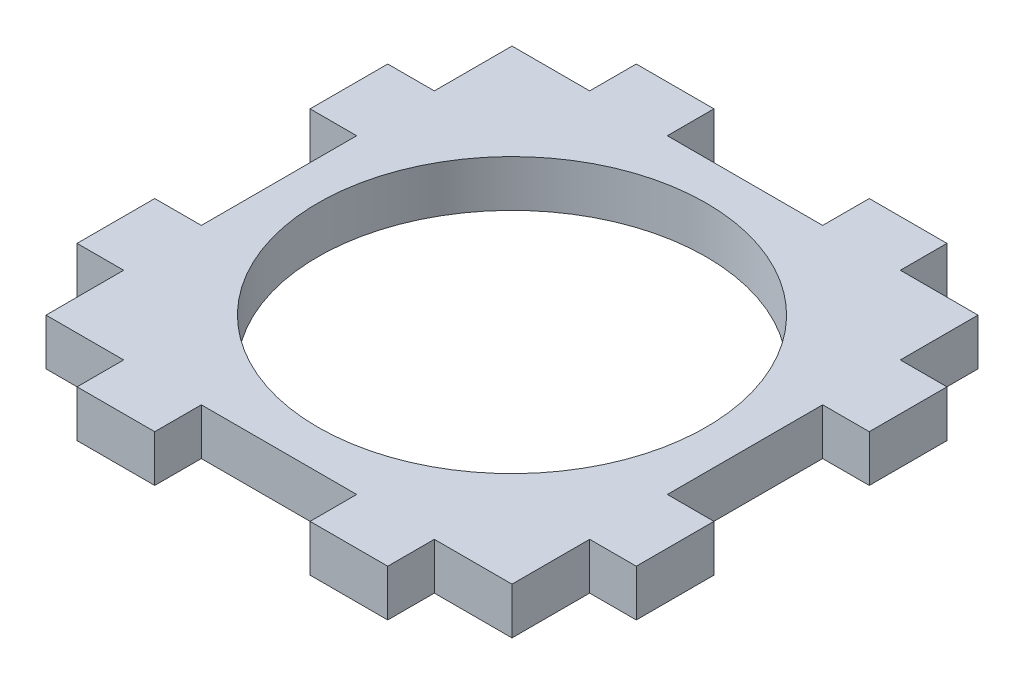
ISO-10303-21;
HEADER;
FILE_DESCRIPTION(('STEP AP214'),'2;1');
FILE_NAME('part.step','',(''),(''),'','','');
FILE_SCHEMA(('AUTOMOTIVE_DESIGN { 1 0 10303 214 1 1 1 1 }'));
ENDSEC;
DATA;
#1=APPLICATION_CONTEXT('core data for automotive mechanical design processes');
#2=APPLICATION_PROTOCOL_DEFINITION('international standard','automotive_design',2000,#1);
#3=PRODUCT_CONTEXT('',#1,'mechanical');
#4=PRODUCT('Part','Part','',(#3));
#5=PRODUCT_RELATED_PRODUCT_CATEGORY('part','',(#4));
#6=PRODUCT_DEFINITION_FORMATION('','',#4);
#7=PRODUCT_DEFINITION_CONTEXT('part definition',#1,'design');
#8=PRODUCT_DEFINITION('design','',#6,#7);
#9=PRODUCT_DEFINITION_SHAPE('','',#8);
#10=(LENGTH_UNIT() NAMED_UNIT(*) SI_UNIT(.MILLI.,.METRE.));
#11=(NAMED_UNIT(*) PLANE_ANGLE_UNIT() SI_UNIT($,.RADIAN.));
#12=(NAMED_UNIT(*) SI_UNIT($,.STERADIAN.) SOLID_ANGLE_UNIT());
#13=UNCERTAINTY_MEASURE_WITH_UNIT(LENGTH_MEASURE(1.E-05),#10,'distance_accuracy_value','');
#14=(GEOMETRIC_REPRESENTATION_CONTEXT(3) GLOBAL_UNCERTAINTY_ASSIGNED_CONTEXT((#13)) GLOBAL_UNIT_ASSIGNED_CONTEXT((#10,
#11,#12)) REPRESENTATION_CONTEXT('',''));
#15=CARTESIAN_POINT('',(0.,0.,0.));
#16=DIRECTION('',(0.,0.,1.));
#17=DIRECTION('',(1.,0.,0.));
#18=AXIS2_PLACEMENT_3D('',#15,#16,#17);
#19=CARTESIAN_POINT('',(30.,6.,0.));
#20=DIRECTION('',(1.,0.,0.));
#21=DIRECTION('',(0.,0.,-1.));
#22=AXIS2_PLACEMENT_3D('',#19,#20,#21);
#23=PLANE('',#22);
#24=DIRECTION('',(0.,0.,1.));
#25=VECTOR('',#24,1.);
#26=CARTESIAN_POINT('',(30.,0.,0.));
#27=LINE('',#26,#25);
#28=CARTESIAN_POINT('',(30.,0.,-30.));
#29=VERTEX_POINT('',#28);
#30=CARTESIAN_POINT('',(30.,0.,-19.9999999999997));
#31=VERTEX_POINT('',#30);
#32=EDGE_CURVE('E302',#29,#31,#27,.T.);
#33=ORIENTED_EDGE('',*,*,#32,.F.);
#34=DIRECTION('',(0.,-1.,0.));
#35=VECTOR('',#34,1.);
#36=CARTESIAN_POINT('',(30.,6.,-30.));
#37=LINE('',#36,#35);
#38=CARTESIAN_POINT('',(30.,6.,-30.));
#39=VERTEX_POINT('',#38);
#40=EDGE_CURVE('E11',#39,#29,#37,.T.);
#41=ORIENTED_EDGE('',*,*,#40,.F.);
#42=DIRECTION('',(0.,0.,1.));
#43=VECTOR('',#42,1.);
#44=CARTESIAN_POINT('',(30.,6.,0.));
#45=LINE('',#44,#43);
#46=CARTESIAN_POINT('',(30.,6.,-19.9999999999997));
#47=VERTEX_POINT('',#46);
#48=EDGE_CURVE('E611',#39,#47,#45,.T.);
#49=ORIENTED_EDGE('',*,*,#48,.T.);
#50=DIRECTION('',(0.,-1.,0.));
#51=VECTOR('',#50,1.);
#52=CARTESIAN_POINT('',(30.,6.,-19.9999999999997));
#53=LINE('',#52,#51);
#54=EDGE_CURVE('E54',#47,#31,#53,.T.);
#55=ORIENTED_EDGE('',*,*,#54,.T.);
#56=EDGE_LOOP('',(#33,#41,#49,#55));
#57=FACE_BOUND('',#56,.T.);
#58=ADVANCED_FACE('F37',(#57),#23,.T.);
#59=CARTESIAN_POINT('',(0.,6.,-30.));
#60=DIRECTION('',(0.,0.,-1.));
#61=DIRECTION('',(-1.,0.,0.));
#62=AXIS2_PLACEMENT_3D('',#59,#60,#61);
#63=PLANE('',#62);
#64=DIRECTION('',(1.,0.,0.));
#65=VECTOR('',#64,1.);
#66=CARTESIAN_POINT('',(0.,0.,-30.));
#67=LINE('',#66,#65);
#68=CARTESIAN_POINT('',(20.0000000000002,0.,-30.));
#69=VERTEX_POINT('',#68);
#70=EDGE_CURVE('E304',#69,#29,#67,.T.);
#71=ORIENTED_EDGE('',*,*,#70,.F.);
#72=DIRECTION('',(0.,-1.,0.));
#73=VECTOR('',#72,1.);
#74=CARTESIAN_POINT('',(20.0000000000002,6.,-30.));
#75=LINE('',#74,#73);
#76=CARTESIAN_POINT('',(20.0000000000002,6.,-30.));
#77=VERTEX_POINT('',#76);
#78=EDGE_CURVE('E46',#77,#69,#75,.T.);
#79=ORIENTED_EDGE('',*,*,#78,.F.);
#80=DIRECTION('',(1.,0.,0.));
#81=VECTOR('',#80,1.);
#82=CARTESIAN_POINT('',(0.,6.,-30.));
#83=LINE('',#82,#81);
#84=EDGE_CURVE('E476',#77,#39,#83,.T.);
#85=ORIENTED_EDGE('',*,*,#84,.T.);
#86=ORIENTED_EDGE('',*,*,#40,.T.);
#87=EDGE_LOOP('',(#71,#79,#85,#86));
#88=FACE_BOUND('',#87,.T.);
#89=ADVANCED_FACE('F475',(#88),#63,.T.);
#90=CARTESIAN_POINT('',(19.9999999999992,6.,6.93889390390704E-13));
#91=DIRECTION('',(-1.,0.,0.));
#92=DIRECTION('',(0.,0.,1.));
#93=AXIS2_PLACEMENT_3D('',#90,#91,#92);
#94=PLANE('',#93);
#95=DIRECTION('',(0.,0.,-1.));
#96=VECTOR('',#95,1.);
#97=CARTESIAN_POINT('',(19.9999999999992,0.,6.93889390390704E-13));
#98=LINE('',#97,#96);
#99=CARTESIAN_POINT('',(20.0000000000004,0.,-35.9999999999998));
#100=VERTEX_POINT('',#99);
#101=EDGE_CURVE('E309',#69,#100,#98,.T.);
#102=ORIENTED_EDGE('',*,*,#101,.T.);
#103=DIRECTION('',(0.,-1.,0.));
#104=VECTOR('',#103,1.);
#105=CARTESIAN_POINT('',(20.0000000000004,6.,-35.9999999999998));
#106=LINE('',#105,#104);
#107=CARTESIAN_POINT('',(20.0000000000004,6.,-35.9999999999998));
#108=VERTEX_POINT('',#107);
#109=EDGE_CURVE('E460',#108,#100,#106,.T.);
#110=ORIENTED_EDGE('',*,*,#109,.F.);
#111=DIRECTION('',(0.,0.,-1.));
#112=VECTOR('',#111,1.);
#113=CARTESIAN_POINT('',(19.9999999999992,6.,6.93889390390704E-13));
#114=LINE('',#113,#112);
#115=EDGE_CURVE('E468',#77,#108,#114,.T.);
#116=ORIENTED_EDGE('',*,*,#115,.F.);
#117=ORIENTED_EDGE('',*,*,#78,.T.);
#118=EDGE_LOOP('',(#102,#110,#116,#117));
#119=FACE_BOUND('',#118,.T.);
#120=ADVANCED_FACE('F465',(#119),#94,.F.);
#121=CARTESIAN_POINT('',(0.,6.,-35.9999999999998));
#122=DIRECTION('',(0.,0.,1.));
#123=DIRECTION('',(1.,0.,0.));
#124=AXIS2_PLACEMENT_3D('',#121,#122,#123);
#125=PLANE('',#124);
#126=DIRECTION('',(-1.,0.,0.));
#127=VECTOR('',#126,1.);
#128=CARTESIAN_POINT('',(0.,0.,-35.9999999999998));
#129=LINE('',#128,#127);
#130=CARTESIAN_POINT('',(10.0000000000004,0.,-35.9999999999998));
#131=VERTEX_POINT('',#130);
#132=EDGE_CURVE('E314',#100,#131,#129,.T.);
#133=ORIENTED_EDGE('',*,*,#132,.T.);
#134=DIRECTION('',(0.,-1.,0.));
#135=VECTOR('',#134,1.);
#136=CARTESIAN_POINT('',(10.0000000000004,6.,-35.9999999999998));
#137=LINE('',#136,#135);
#138=CARTESIAN_POINT('',(10.0000000000004,6.,-35.9999999999998));
#139=VERTEX_POINT('',#138);
#140=EDGE_CURVE('E458',#139,#131,#137,.T.);
#141=ORIENTED_EDGE('',*,*,#140,.F.);
#142=DIRECTION('',(-1.,0.,0.));
#143=VECTOR('',#142,1.);
#144=CARTESIAN_POINT('',(0.,6.,-35.9999999999998));
#145=LINE('',#144,#143);
#146=EDGE_CURVE('E608',#108,#139,#145,.T.);
#147=ORIENTED_EDGE('',*,*,#146,.F.);
#148=ORIENTED_EDGE('',*,*,#109,.T.);
#149=EDGE_LOOP('',(#133,#141,#147,#148));
#150=FACE_BOUND('',#149,.T.);
#151=ADVANCED_FACE('F607',(#150),#125,.F.);
#152=CARTESIAN_POINT('',(9.99999999999917,6.,3.44053489402047E-13));
#153=DIRECTION('',(-1.,0.,0.));
#154=DIRECTION('',(0.,0.,1.));
#155=AXIS2_PLACEMENT_3D('',#152,#153,#154);
#156=PLANE('',#155);
#157=DIRECTION('',(0.,0.,-1.));
#158=VECTOR('',#157,1.);
#159=CARTESIAN_POINT('',(9.99999999999917,0.,3.44053489402047E-13));
#160=LINE('',#159,#158);
#161=CARTESIAN_POINT('',(10.0000000000002,0.,-30.));
#162=VERTEX_POINT('',#161);
#163=EDGE_CURVE('E317',#162,#131,#160,.T.);
#164=ORIENTED_EDGE('',*,*,#163,.F.);
#165=DIRECTION('',(0.,-1.,0.));
#166=VECTOR('',#165,1.);
#167=CARTESIAN_POINT('',(10.0000000000002,6.,-30.));
#168=LINE('',#167,#166);
#169=CARTESIAN_POINT('',(10.0000000000002,6.,-30.));
#170=VERTEX_POINT('',#169);
#171=EDGE_CURVE('E456',#170,#162,#168,.T.);
#172=ORIENTED_EDGE('',*,*,#171,.F.);
#173=DIRECTION('',(0.,0.,-1.));
#174=VECTOR('',#173,1.);
#175=CARTESIAN_POINT('',(9.99999999999917,6.,3.44053489402047E-13));
#176=LINE('',#175,#174);
#177=EDGE_CURVE('E605',#170,#139,#176,.T.);
#178=ORIENTED_EDGE('',*,*,#177,.T.);
#179=ORIENTED_EDGE('',*,*,#140,.T.);
#180=EDGE_LOOP('',(#164,#172,#178,#179));
#181=FACE_BOUND('',#180,.T.);
#182=ADVANCED_FACE('F603',(#181),#156,.T.);
#183=CARTESIAN_POINT('',(-9.99999999999969,0.,-30.));
#184=VERTEX_POINT('',#183);
#185=EDGE_CURVE('E311',#184,#162,#67,.T.);
#186=ORIENTED_EDGE('',*,*,#185,.F.);
#187=DIRECTION('',(0.,-1.,0.));
#188=VECTOR('',#187,1.);
#189=CARTESIAN_POINT('',(-9.99999999999969,6.,-30.));
#190=LINE('',#189,#188);
#191=CARTESIAN_POINT('',(-9.99999999999969,6.,-30.));
#192=VERTEX_POINT('',#191);
#193=EDGE_CURVE('E454',#192,#184,#190,.T.);
#194=ORIENTED_EDGE('',*,*,#193,.F.);
#195=EDGE_CURVE('E599',#192,#170,#83,.T.);
#196=ORIENTED_EDGE('',*,*,#195,.T.);
#197=ORIENTED_EDGE('',*,*,#171,.T.);
#198=EDGE_LOOP('',(#186,#194,#196,#197));
#199=FACE_BOUND('',#198,.T.);
#200=ADVANCED_FACE('F497',(#199),#63,.T.);
#201=CARTESIAN_POINT('',(-10.0000000000007,6.,-3.15141431469159E-13));
#202=DIRECTION('',(-1.,0.,0.));
#203=DIRECTION('',(0.,0.,1.));
#204=AXIS2_PLACEMENT_3D('',#201,#202,#203);
#205=PLANE('',#204);
#206=DIRECTION('',(0.,0.,-1.));
#207=VECTOR('',#206,1.);
#208=CARTESIAN_POINT('',(-10.0000000000007,0.,-3.15141431469159E-13));
#209=LINE('',#208,#207);
#210=CARTESIAN_POINT('',(-9.9999999999996,0.,-35.9999999999998));
#211=VERTEX_POINT('',#210);
#212=EDGE_CURVE('E320',#184,#211,#209,.T.);
#213=ORIENTED_EDGE('',*,*,#212,.T.);
#214=DIRECTION('',(0.,-1.,0.));
#215=VECTOR('',#214,1.);
#216=CARTESIAN_POINT('',(-9.9999999999996,6.,-35.9999999999998));
#217=LINE('',#216,#215);
#218=CARTESIAN_POINT('',(-9.9999999999996,6.,-35.9999999999998));
#219=VERTEX_POINT('',#218);
#220=EDGE_CURVE('E452',#219,#211,#217,.T.);
#221=ORIENTED_EDGE('',*,*,#220,.F.);
#222=DIRECTION('',(0.,0.,-1.));
#223=VECTOR('',#222,1.);
#224=CARTESIAN_POINT('',(-10.0000000000007,6.,-3.15141431469159E-13));
#225=LINE('',#224,#223);
#226=EDGE_CURVE('E616',#192,#219,#225,.T.);
#227=ORIENTED_EDGE('',*,*,#226,.F.);
#228=ORIENTED_EDGE('',*,*,#193,.T.);
#229=EDGE_LOOP('',(#213,#221,#227,#228));
#230=FACE_BOUND('',#229,.T.);
#231=ADVANCED_FACE('F932',(#230),#205,.F.);
#232=CARTESIAN_POINT('',(0.,6.,-35.9999999999998));
#233=DIRECTION('',(0.,0.,-1.));
#234=DIRECTION('',(-1.,0.,0.));
#235=AXIS2_PLACEMENT_3D('',#232,#233,#234);
#236=PLANE('',#235);
#237=DIRECTION('',(1.,0.,0.));
#238=VECTOR('',#237,1.);
#239=CARTESIAN_POINT('',(0.,0.,-35.9999999999998));
#240=LINE('',#239,#238);
#241=CARTESIAN_POINT('',(-19.9999999999996,0.,-35.9999999999998));
#242=VERTEX_POINT('',#241);
#243=EDGE_CURVE('E323',#242,#211,#240,.T.);
#244=ORIENTED_EDGE('',*,*,#243,.F.);
#245=DIRECTION('',(0.,-1.,0.));
#246=VECTOR('',#245,1.);
#247=CARTESIAN_POINT('',(-19.9999999999996,6.,-35.9999999999998));
#248=LINE('',#247,#246);
#249=CARTESIAN_POINT('',(-19.9999999999996,6.,-35.9999999999998));
#250=VERTEX_POINT('',#249);
#251=EDGE_CURVE('E450',#250,#242,#248,.T.);
#252=ORIENTED_EDGE('',*,*,#251,.F.);
#253=DIRECTION('',(1.,0.,0.));
#254=VECTOR('',#253,1.);
#255=CARTESIAN_POINT('',(0.,6.,-35.9999999999998));
#256=LINE('',#255,#254);
#257=EDGE_CURVE('E618',#250,#219,#256,.T.);
#258=ORIENTED_EDGE('',*,*,#257,.T.);
#259=ORIENTED_EDGE('',*,*,#220,.T.);
#260=EDGE_LOOP('',(#244,#252,#258,#259));
#261=FACE_BOUND('',#260,.T.);
#262=ADVANCED_FACE('F921',(#261),#236,.T.);
#263=CARTESIAN_POINT('',(-20.0000000000008,6.,-6.47630097698073E-13));
#264=DIRECTION('',(-1.,0.,0.));
#265=DIRECTION('',(0.,0.,1.));
#266=AXIS2_PLACEMENT_3D('',#263,#264,#265);
#267=PLANE('',#266);
#268=DIRECTION('',(0.,0.,-1.));
#269=VECTOR('',#268,1.);
#270=CARTESIAN_POINT('',(-20.0000000000008,0.,-6.47630097698073E-13));
#271=LINE('',#270,#269);
#272=CARTESIAN_POINT('',(-19.9999999999997,0.,-30.));
#273=VERTEX_POINT('',#272);
#274=EDGE_CURVE('E326',#273,#242,#271,.T.);
#275=ORIENTED_EDGE('',*,*,#274,.F.);
#276=DIRECTION('',(0.,-1.,0.));
#277=VECTOR('',#276,1.);
#278=CARTESIAN_POINT('',(-19.9999999999997,6.,-30.));
#279=LINE('',#278,#277);
#280=CARTESIAN_POINT('',(-19.9999999999997,6.,-30.));
#281=VERTEX_POINT('',#280);
#282=EDGE_CURVE('E448',#281,#273,#279,.T.);
#283=ORIENTED_EDGE('',*,*,#282,.F.);
#284=DIRECTION('',(0.,0.,-1.));
#285=VECTOR('',#284,1.);
#286=CARTESIAN_POINT('',(-20.0000000000008,6.,-6.47630097698073E-13));
#287=LINE('',#286,#285);
#288=EDGE_CURVE('E621',#281,#250,#287,.T.);
#289=ORIENTED_EDGE('',*,*,#288,.T.);
#290=ORIENTED_EDGE('',*,*,#251,.T.);
#291=EDGE_LOOP('',(#275,#283,#289,#290));
#292=FACE_BOUND('',#291,.T.);
#293=ADVANCED_FACE('F911',(#292),#267,.T.);
#294=CARTESIAN_POINT('',(-30.,0.,-30.));
#295=VERTEX_POINT('',#294);
#296=EDGE_CURVE('E310',#295,#273,#67,.T.);
#297=ORIENTED_EDGE('',*,*,#296,.F.);
#298=DIRECTION('',(0.,-1.,0.));
#299=VECTOR('',#298,1.);
#300=CARTESIAN_POINT('',(-30.,6.,-30.));
#301=LINE('',#300,#299);
#302=CARTESIAN_POINT('',(-30.,6.,-30.));
#303=VERTEX_POINT('',#302);
#304=EDGE_CURVE('E446',#303,#295,#301,.T.);
#305=ORIENTED_EDGE('',*,*,#304,.F.);
#306=EDGE_CURVE('E589',#303,#281,#83,.T.);
#307=ORIENTED_EDGE('',*,*,#306,.T.);
#308=ORIENTED_EDGE('',*,*,#282,.T.);
#309=EDGE_LOOP('',(#297,#305,#307,#308));
#310=FACE_BOUND('',#309,.T.);
#311=ADVANCED_FACE('F498',(#310),#63,.T.);
#312=CARTESIAN_POINT('',(-30.,6.,0.));
#313=DIRECTION('',(1.,0.,0.));
#314=DIRECTION('',(0.,0.,-1.));
#315=AXIS2_PLACEMENT_3D('',#312,#313,#314);
#316=PLANE('',#315);
#317=DIRECTION('',(0.,0.,1.));
#318=VECTOR('',#317,1.);
#319=CARTESIAN_POINT('',(-30.,0.,0.));
#320=LINE('',#319,#318);
#321=CARTESIAN_POINT('',(-30.,0.,-20.0000000000001));
#322=VERTEX_POINT('',#321);
#323=EDGE_CURVE('E329',#295,#322,#320,.T.);
#324=ORIENTED_EDGE('',*,*,#323,.T.);
#325=DIRECTION('',(0.,-1.,0.));
#326=VECTOR('',#325,1.);
#327=CARTESIAN_POINT('',(-30.,6.,-20.0000000000001));
#328=LINE('',#327,#326);
#329=CARTESIAN_POINT('',(-30.,6.,-20.0000000000001));
#330=VERTEX_POINT('',#329);
#331=EDGE_CURVE('E443',#330,#322,#328,.T.);
#332=ORIENTED_EDGE('',*,*,#331,.F.);
#333=DIRECTION('',(0.,0.,1.));
#334=VECTOR('',#333,1.);
#335=CARTESIAN_POINT('',(-30.,6.,0.));
#336=LINE('',#335,#334);
#337=EDGE_CURVE('E585',#303,#330,#336,.T.);
#338=ORIENTED_EDGE('',*,*,#337,.F.);
#339=ORIENTED_EDGE('',*,*,#304,.T.);
#340=EDGE_LOOP('',(#324,#332,#338,#339));
#341=FACE_BOUND('',#340,.T.);
#342=ADVANCED_FACE('F584',(#341),#316,.F.);
#343=CARTESIAN_POINT('',(0.,6.,-20.0000000000002));
#344=DIRECTION('',(0.,0.,1.));
#345=DIRECTION('',(1.,0.,0.));
#346=AXIS2_PLACEMENT_3D('',#343,#344,#345);
#347=PLANE('',#346);
#348=DIRECTION('',(-1.,0.,0.));
#349=VECTOR('',#348,1.);
#350=CARTESIAN_POINT('',(0.,0.,-20.0000000000002));
#351=LINE('',#350,#349);
#352=CARTESIAN_POINT('',(-35.9999999999997,0.,-20.0000000000001));
#353=VERTEX_POINT('',#352);
#354=EDGE_CURVE('E332',#322,#353,#351,.T.);
#355=ORIENTED_EDGE('',*,*,#354,.T.);
#356=DIRECTION('',(0.,-1.,0.));
#357=VECTOR('',#356,1.);
#358=CARTESIAN_POINT('',(-35.9999999999997,6.,-20.0000000000001));
#359=LINE('',#358,#357);
#360=CARTESIAN_POINT('',(-35.9999999999997,6.,-20.0000000000001));
#361=VERTEX_POINT('',#360);
#362=EDGE_CURVE('E440',#361,#353,#359,.T.);
#363=ORIENTED_EDGE('',*,*,#362,.F.);
#364=DIRECTION('',(-1.,0.,0.));
#365=VECTOR('',#364,1.);
#366=CARTESIAN_POINT('',(0.,6.,-20.0000000000002));
#367=LINE('',#366,#365);
#368=EDGE_CURVE('E580',#330,#361,#367,.T.);
#369=ORIENTED_EDGE('',*,*,#368,.F.);
#370=ORIENTED_EDGE('',*,*,#331,.T.);
#371=EDGE_LOOP('',(#355,#363,#369,#370));
#372=FACE_BOUND('',#371,.T.);
#373=ADVANCED_FACE('F578',(#372),#347,.F.);
#374=CARTESIAN_POINT('',(-35.9999999999997,6.,0.));
#375=DIRECTION('',(1.,0.,0.));
#376=DIRECTION('',(0.,0.,-1.));
#377=AXIS2_PLACEMENT_3D('',#374,#375,#376);
#378=PLANE('',#377);
#379=DIRECTION('',(0.,0.,1.));
#380=VECTOR('',#379,1.);
#381=CARTESIAN_POINT('',(-35.9999999999997,0.,0.));
#382=LINE('',#381,#380);
#383=CARTESIAN_POINT('',(-35.9999999999997,0.,-10.0000000000001));
#384=VERTEX_POINT('',#383);
#385=EDGE_CURVE('E337',#353,#384,#382,.T.);
#386=ORIENTED_EDGE('',*,*,#385,.T.);
#387=DIRECTION('',(0.,-1.,0.));
#388=VECTOR('',#387,1.);
#389=CARTESIAN_POINT('',(-35.9999999999997,6.,-10.0000000000001));
#390=LINE('',#389,#388);
#391=CARTESIAN_POINT('',(-35.9999999999997,6.,-10.0000000000001));
#392=VERTEX_POINT('',#391);
#393=EDGE_CURVE('E438',#392,#384,#390,.T.);
#394=ORIENTED_EDGE('',*,*,#393,.F.);
#395=DIRECTION('',(0.,0.,1.));
#396=VECTOR('',#395,1.);
#397=CARTESIAN_POINT('',(-35.9999999999997,6.,0.));
#398=LINE('',#397,#396);
#399=EDGE_CURVE('E628',#361,#392,#398,.T.);
#400=ORIENTED_EDGE('',*,*,#399,.F.);
#401=ORIENTED_EDGE('',*,*,#362,.T.);
#402=EDGE_LOOP('',(#386,#394,#400,#401));
#403=FACE_BOUND('',#402,.T.);
#404=ADVANCED_FACE('F571',(#403),#378,.F.);
#405=CARTESIAN_POINT('',(0.,6.,-10.0000000000002));
#406=DIRECTION('',(0.,0.,1.));
#407=DIRECTION('',(1.,0.,0.));
#408=AXIS2_PLACEMENT_3D('',#405,#406,#407);
#409=PLANE('',#408);
#410=DIRECTION('',(-1.,0.,0.));
#411=VECTOR('',#410,1.);
#412=CARTESIAN_POINT('',(0.,0.,-10.0000000000002));
#413=LINE('',#412,#411);
#414=CARTESIAN_POINT('',(-30.,0.,-10.0000000000001));
#415=VERTEX_POINT('',#414);
#416=EDGE_CURVE('E340',#415,#384,#413,.T.);
#417=ORIENTED_EDGE('',*,*,#416,.F.);
#418=DIRECTION('',(0.,-1.,0.));
#419=VECTOR('',#418,1.);
#420=CARTESIAN_POINT('',(-30.,6.,-10.0000000000001));
#421=LINE('',#420,#419);
#422=CARTESIAN_POINT('',(-30.,6.,-10.0000000000001));
#423=VERTEX_POINT('',#422);
#424=EDGE_CURVE('E436',#423,#415,#421,.T.);
#425=ORIENTED_EDGE('',*,*,#424,.F.);
#426=DIRECTION('',(-1.,0.,0.));
#427=VECTOR('',#426,1.);
#428=CARTESIAN_POINT('',(0.,6.,-10.0000000000002));
#429=LINE('',#428,#427);
#430=EDGE_CURVE('E569',#423,#392,#429,.T.);
#431=ORIENTED_EDGE('',*,*,#430,.T.);
#432=ORIENTED_EDGE('',*,*,#393,.T.);
#433=EDGE_LOOP('',(#417,#425,#431,#432));
#434=FACE_BOUND('',#433,.T.);
#435=ADVANCED_FACE('F565',(#434),#409,.T.);
#436=CARTESIAN_POINT('',(-30.,0.,9.9999999999999));
#437=VERTEX_POINT('',#436);
#438=EDGE_CURVE('E334',#415,#437,#320,.T.);
#439=ORIENTED_EDGE('',*,*,#438,.T.);
#440=DIRECTION('',(0.,-1.,0.));
#441=VECTOR('',#440,1.);
#442=CARTESIAN_POINT('',(-30.,6.,9.9999999999999));
#443=LINE('',#442,#441);
#444=CARTESIAN_POINT('',(-30.,6.,9.9999999999999));
#445=VERTEX_POINT('',#444);
#446=EDGE_CURVE('E433',#445,#437,#443,.T.);
#447=ORIENTED_EDGE('',*,*,#446,.F.);
#448=EDGE_CURVE('E626',#423,#445,#336,.T.);
#449=ORIENTED_EDGE('',*,*,#448,.F.);
#450=ORIENTED_EDGE('',*,*,#424,.T.);
#451=EDGE_LOOP('',(#439,#447,#449,#450));
#452=FACE_BOUND('',#451,.T.);
#453=ADVANCED_FACE('F561',(#452),#316,.F.);
#454=CARTESIAN_POINT('',(0.,6.,9.99999999999974));
#455=DIRECTION('',(0.,0.,1.));
#456=DIRECTION('',(1.,0.,0.));
#457=AXIS2_PLACEMENT_3D('',#454,#455,#456);
#458=PLANE('',#457);
#459=DIRECTION('',(-1.,0.,0.));
#460=VECTOR('',#459,1.);
#461=CARTESIAN_POINT('',(0.,0.,9.99999999999974));
#462=LINE('',#461,#460);
#463=CARTESIAN_POINT('',(-35.9999999999997,0.,9.99999999999992));
#464=VERTEX_POINT('',#463);
#465=EDGE_CURVE('E343',#437,#464,#462,.T.);
#466=ORIENTED_EDGE('',*,*,#465,.T.);
#467=DIRECTION('',(0.,-1.,0.));
#468=VECTOR('',#467,1.);
#469=CARTESIAN_POINT('',(-35.9999999999997,6.,9.99999999999992));
#470=LINE('',#469,#468);
#471=CARTESIAN_POINT('',(-35.9999999999997,6.,9.99999999999992));
#472=VERTEX_POINT('',#471);
#473=EDGE_CURVE('E431',#472,#464,#470,.T.);
#474=ORIENTED_EDGE('',*,*,#473,.F.);
#475=DIRECTION('',(-1.,0.,0.));
#476=VECTOR('',#475,1.);
#477=CARTESIAN_POINT('',(0.,6.,9.99999999999974));
#478=LINE('',#477,#476);
#479=EDGE_CURVE('E631',#445,#472,#478,.T.);
#480=ORIENTED_EDGE('',*,*,#479,.F.);
#481=ORIENTED_EDGE('',*,*,#446,.T.);
#482=EDGE_LOOP('',(#466,#474,#480,#481));
#483=FACE_BOUND('',#482,.T.);
#484=ADVANCED_FACE('F851',(#483),#458,.F.);
#485=CARTESIAN_POINT('',(-35.9999999999997,6.,0.));
#486=DIRECTION('',(-1.,0.,0.));
#487=DIRECTION('',(0.,0.,1.));
#488=AXIS2_PLACEMENT_3D('',#485,#486,#487);
#489=PLANE('',#488);
#490=DIRECTION('',(0.,0.,-1.));
#491=VECTOR('',#490,1.);
#492=CARTESIAN_POINT('',(-35.9999999999997,0.,0.));
#493=LINE('',#492,#491);
#494=CARTESIAN_POINT('',(-35.9999999999997,0.,19.9999999999999));
#495=VERTEX_POINT('',#494);
#496=EDGE_CURVE('E346',#495,#464,#493,.T.);
#497=ORIENTED_EDGE('',*,*,#496,.F.);
#498=DIRECTION('',(0.,-1.,0.));
#499=VECTOR('',#498,1.);
#500=CARTESIAN_POINT('',(-35.9999999999997,6.,19.9999999999999));
#501=LINE('',#500,#499);
#502=CARTESIAN_POINT('',(-35.9999999999997,6.,19.9999999999999));
#503=VERTEX_POINT('',#502);
#504=EDGE_CURVE('E429',#503,#495,#501,.T.);
#505=ORIENTED_EDGE('',*,*,#504,.F.);
#506=DIRECTION('',(0.,0.,-1.));
#507=VECTOR('',#506,1.);
#508=CARTESIAN_POINT('',(-35.9999999999997,6.,0.));
#509=LINE('',#508,#507);
#510=EDGE_CURVE('E633',#503,#472,#509,.T.);
#511=ORIENTED_EDGE('',*,*,#510,.T.);
#512=ORIENTED_EDGE('',*,*,#473,.T.);
#513=EDGE_LOOP('',(#497,#505,#511,#512));
#514=FACE_BOUND('',#513,.T.);
#515=ADVANCED_FACE('F840',(#514),#489,.T.);
#516=CARTESIAN_POINT('',(0.,6.,19.9999999999998));
#517=DIRECTION('',(0.,0.,1.));
#518=DIRECTION('',(1.,0.,0.));
#519=AXIS2_PLACEMENT_3D('',#516,#517,#518);
#520=PLANE('',#519);
#521=DIRECTION('',(-1.,0.,0.));
#522=VECTOR('',#521,1.);
#523=CARTESIAN_POINT('',(0.,0.,19.9999999999998));
#524=LINE('',#523,#522);
#525=CARTESIAN_POINT('',(-30.,0.,19.9999999999999));
#526=VERTEX_POINT('',#525);
#527=EDGE_CURVE('E349',#526,#495,#524,.T.);
#528=ORIENTED_EDGE('',*,*,#527,.F.);
#529=DIRECTION('',(0.,-1.,0.));
#530=VECTOR('',#529,1.);
#531=CARTESIAN_POINT('',(-30.,6.,19.9999999999999));
#532=LINE('',#531,#530);
#533=CARTESIAN_POINT('',(-30.,6.,19.9999999999999));
#534=VERTEX_POINT('',#533);
#535=EDGE_CURVE('E427',#534,#526,#532,.T.);
#536=ORIENTED_EDGE('',*,*,#535,.F.);
#537=DIRECTION('',(-1.,0.,0.));
#538=VECTOR('',#537,1.);
#539=CARTESIAN_POINT('',(0.,6.,19.9999999999998));
#540=LINE('',#539,#538);
#541=EDGE_CURVE('E636',#534,#503,#540,.T.);
#542=ORIENTED_EDGE('',*,*,#541,.T.);
#543=ORIENTED_EDGE('',*,*,#504,.T.);
#544=EDGE_LOOP('',(#528,#536,#542,#543));
#545=FACE_BOUND('',#544,.T.);
#546=ADVANCED_FACE('F829',(#545),#520,.T.);
#547=CARTESIAN_POINT('',(-30.,0.,30.));
#548=VERTEX_POINT('',#547);
#549=EDGE_CURVE('E333',#526,#548,#320,.T.);
#550=ORIENTED_EDGE('',*,*,#549,.T.);
#551=DIRECTION('',(0.,-1.,0.));
#552=VECTOR('',#551,1.);
#553=CARTESIAN_POINT('',(-30.,6.,30.));
#554=LINE('',#553,#552);
#555=CARTESIAN_POINT('',(-30.,6.,30.));
#556=VERTEX_POINT('',#555);
#557=EDGE_CURVE('E424',#556,#548,#554,.T.);
#558=ORIENTED_EDGE('',*,*,#557,.F.);
#559=EDGE_CURVE('E625',#534,#556,#336,.T.);
#560=ORIENTED_EDGE('',*,*,#559,.F.);
#561=ORIENTED_EDGE('',*,*,#535,.T.);
#562=EDGE_LOOP('',(#550,#558,#560,#561));
#563=FACE_BOUND('',#562,.T.);
#564=ADVANCED_FACE('F555',(#563),#316,.F.);
#565=CARTESIAN_POINT('',(0.,6.,30.));
#566=DIRECTION('',(0.,0.,-1.));
#567=DIRECTION('',(-1.,0.,0.));
#568=AXIS2_PLACEMENT_3D('',#565,#566,#567);
#569=PLANE('',#568);
#570=DIRECTION('',(1.,0.,0.));
#571=VECTOR('',#570,1.);
#572=CARTESIAN_POINT('',(0.,0.,30.));
#573=LINE('',#572,#571);
#574=CARTESIAN_POINT('',(-20.,0.,30.));
#575=VERTEX_POINT('',#574);
#576=EDGE_CURVE('E352',#548,#575,#573,.T.);
#577=ORIENTED_EDGE('',*,*,#576,.T.);
#578=DIRECTION('',(0.,-1.,0.));
#579=VECTOR('',#578,1.);
#580=CARTESIAN_POINT('',(-20.,6.,30.));
#581=LINE('',#580,#579);
#582=CARTESIAN_POINT('',(-20.,6.,30.));
#583=VERTEX_POINT('',#582);
#584=EDGE_CURVE('E421',#583,#575,#581,.T.);
#585=ORIENTED_EDGE('',*,*,#584,.F.);
#586=DIRECTION('',(1.,0.,0.));
#587=VECTOR('',#586,1.);
#588=CARTESIAN_POINT('',(0.,6.,30.));
#589=LINE('',#588,#587);
#590=EDGE_CURVE('E551',#556,#583,#589,.T.);
#591=ORIENTED_EDGE('',*,*,#590,.F.);
#592=ORIENTED_EDGE('',*,*,#557,.T.);
#593=EDGE_LOOP('',(#577,#585,#591,#592));
#594=FACE_BOUND('',#593,.T.);
#595=ADVANCED_FACE('F548',(#594),#569,.F.);
#596=CARTESIAN_POINT('',(-20.,6.,0.));
#597=DIRECTION('',(1.,0.,0.));
#598=DIRECTION('',(0.,0.,-1.));
#599=AXIS2_PLACEMENT_3D('',#596,#597,#598);
#600=PLANE('',#599);
#601=DIRECTION('',(0.,0.,1.));
#602=VECTOR('',#601,1.);
#603=CARTESIAN_POINT('',(-20.,0.,0.));
#604=LINE('',#603,#602);
#605=CARTESIAN_POINT('',(-20.,0.,36.));
#606=VERTEX_POINT('',#605);
#607=EDGE_CURVE('E355',#575,#606,#604,.T.);
#608=ORIENTED_EDGE('',*,*,#607,.T.);
#609=DIRECTION('',(0.,-1.,0.));
#610=VECTOR('',#609,1.);
#611=CARTESIAN_POINT('',(-20.,6.,36.));
#612=LINE('',#611,#610);
#613=CARTESIAN_POINT('',(-20.,6.,36.));
#614=VERTEX_POINT('',#613);
#615=EDGE_CURVE('E418',#614,#606,#612,.T.);
#616=ORIENTED_EDGE('',*,*,#615,.F.);
#617=DIRECTION('',(0.,0.,1.));
#618=VECTOR('',#617,1.);
#619=CARTESIAN_POINT('',(-20.,6.,0.));
#620=LINE('',#619,#618);
#621=EDGE_CURVE('E545',#583,#614,#620,.T.);
#622=ORIENTED_EDGE('',*,*,#621,.F.);
#623=ORIENTED_EDGE('',*,*,#584,.T.);
#624=EDGE_LOOP('',(#608,#616,#622,#623));
#625=FACE_BOUND('',#624,.T.);
#626=ADVANCED_FACE('F543',(#625),#600,.F.);
#627=CARTESIAN_POINT('',(0.,6.,36.));
#628=DIRECTION('',(0.,0.,-1.));
#629=DIRECTION('',(-1.,0.,0.));
#630=AXIS2_PLACEMENT_3D('',#627,#628,#629);
#631=PLANE('',#630);
#632=DIRECTION('',(1.,0.,0.));
#633=VECTOR('',#632,1.);
#634=CARTESIAN_POINT('',(0.,0.,36.));
#635=LINE('',#634,#633);
#636=CARTESIAN_POINT('',(-9.99999999999999,0.,36.));
#637=VERTEX_POINT('',#636);
#638=EDGE_CURVE('E360',#606,#637,#635,.T.);
#639=ORIENTED_EDGE('',*,*,#638,.T.);
#640=DIRECTION('',(0.,-1.,0.));
#641=VECTOR('',#640,1.);
#642=CARTESIAN_POINT('',(-9.99999999999999,6.,36.));
#643=LINE('',#642,#641);
#644=CARTESIAN_POINT('',(-9.99999999999999,6.,36.));
#645=VERTEX_POINT('',#644);
#646=EDGE_CURVE('E416',#645,#637,#643,.T.);
#647=ORIENTED_EDGE('',*,*,#646,.F.);
#648=DIRECTION('',(1.,0.,0.));
#649=VECTOR('',#648,1.);
#650=CARTESIAN_POINT('',(0.,6.,36.));
#651=LINE('',#650,#649);
#652=EDGE_CURVE('E643',#614,#645,#651,.T.);
#653=ORIENTED_EDGE('',*,*,#652,.F.);
#654=ORIENTED_EDGE('',*,*,#615,.T.);
#655=EDGE_LOOP('',(#639,#647,#653,#654));
#656=FACE_BOUND('',#655,.T.);
#657=ADVANCED_FACE('F538',(#656),#631,.F.);
#658=CARTESIAN_POINT('',(-9.99999999999999,6.,0.));
#659=DIRECTION('',(1.,0.,0.));
#660=DIRECTION('',(0.,0.,-1.));
#661=AXIS2_PLACEMENT_3D('',#658,#659,#660);
#662=PLANE('',#661);
#663=DIRECTION('',(0.,0.,1.));
#664=VECTOR('',#663,1.);
#665=CARTESIAN_POINT('',(-9.99999999999999,0.,0.));
#666=LINE('',#665,#664);
#667=CARTESIAN_POINT('',(-9.99999999999999,0.,30.));
#668=VERTEX_POINT('',#667);
#669=EDGE_CURVE('E363',#668,#637,#666,.T.);
#670=ORIENTED_EDGE('',*,*,#669,.F.);
#671=DIRECTION('',(0.,-1.,0.));
#672=VECTOR('',#671,1.);
#673=CARTESIAN_POINT('',(-9.99999999999999,6.,30.));
#674=LINE('',#673,#672);
#675=CARTESIAN_POINT('',(-9.99999999999999,6.,30.));
#676=VERTEX_POINT('',#675);
#677=EDGE_CURVE('E414',#676,#668,#674,.T.);
#678=ORIENTED_EDGE('',*,*,#677,.F.);
#679=DIRECTION('',(0.,0.,1.));
#680=VECTOR('',#679,1.);
#681=CARTESIAN_POINT('',(-9.99999999999999,6.,0.));
#682=LINE('',#681,#680);
#683=EDGE_CURVE('E536',#676,#645,#682,.T.);
#684=ORIENTED_EDGE('',*,*,#683,.T.);
#685=ORIENTED_EDGE('',*,*,#646,.T.);
#686=EDGE_LOOP('',(#670,#678,#684,#685));
#687=FACE_BOUND('',#686,.T.);
#688=ADVANCED_FACE('F532',(#687),#662,.T.);
#689=CARTESIAN_POINT('',(10.,0.,30.));
#690=VERTEX_POINT('',#689);
#691=EDGE_CURVE('E357',#668,#690,#573,.T.);
#692=ORIENTED_EDGE('',*,*,#691,.T.);
#693=DIRECTION('',(0.,-1.,0.));
#694=VECTOR('',#693,1.);
#695=CARTESIAN_POINT('',(10.,6.,30.));
#696=LINE('',#695,#694);
#697=CARTESIAN_POINT('',(10.,6.,30.));
#698=VERTEX_POINT('',#697);
#699=EDGE_CURVE('E411',#698,#690,#696,.T.);
#700=ORIENTED_EDGE('',*,*,#699,.F.);
#701=EDGE_CURVE('E641',#676,#698,#589,.T.);
#702=ORIENTED_EDGE('',*,*,#701,.F.);
#703=ORIENTED_EDGE('',*,*,#677,.T.);
#704=EDGE_LOOP('',(#692,#700,#702,#703));
#705=FACE_BOUND('',#704,.T.);
#706=ADVANCED_FACE('F528',(#705),#569,.F.);
#707=CARTESIAN_POINT('',(9.99999999999991,6.,0.));
#708=DIRECTION('',(1.,0.,0.));
#709=DIRECTION('',(0.,0.,-1.));
#710=AXIS2_PLACEMENT_3D('',#707,#708,#709);
#711=PLANE('',#710);
#712=DIRECTION('',(0.,0.,1.));
#713=VECTOR('',#712,1.);
#714=CARTESIAN_POINT('',(9.99999999999991,0.,0.));
#715=LINE('',#714,#713);
#716=CARTESIAN_POINT('',(10.,0.,36.));
#717=VERTEX_POINT('',#716);
#718=EDGE_CURVE('E366',#690,#717,#715,.T.);
#719=ORIENTED_EDGE('',*,*,#718,.T.);
#720=DIRECTION('',(0.,-1.,0.));
#721=VECTOR('',#720,1.);
#722=CARTESIAN_POINT('',(10.,6.,36.));
#723=LINE('',#722,#721);
#724=CARTESIAN_POINT('',(10.,6.,36.));
#725=VERTEX_POINT('',#724);
#726=EDGE_CURVE('E409',#725,#717,#723,.T.);
#727=ORIENTED_EDGE('',*,*,#726,.F.);
#728=DIRECTION('',(0.,0.,1.));
#729=VECTOR('',#728,1.);
#730=CARTESIAN_POINT('',(9.99999999999991,6.,0.));
#731=LINE('',#730,#729);
#732=EDGE_CURVE('E646',#698,#725,#731,.T.);
#733=ORIENTED_EDGE('',*,*,#732,.F.);
#734=ORIENTED_EDGE('',*,*,#699,.T.);
#735=EDGE_LOOP('',(#719,#727,#733,#734));
#736=FACE_BOUND('',#735,.T.);
#737=ADVANCED_FACE('F769',(#736),#711,.F.);
#738=CARTESIAN_POINT('',(0.,6.,36.));
#739=DIRECTION('',(0.,0.,1.));
#740=DIRECTION('',(1.,0.,0.));
#741=AXIS2_PLACEMENT_3D('',#738,#739,#740);
#742=PLANE('',#741);
#743=DIRECTION('',(-1.,0.,0.));
#744=VECTOR('',#743,1.);
#745=CARTESIAN_POINT('',(0.,0.,36.));
#746=LINE('',#745,#744);
#747=CARTESIAN_POINT('',(20.,0.,36.));
#748=VERTEX_POINT('',#747);
#749=EDGE_CURVE('E369',#748,#717,#746,.T.);
#750=ORIENTED_EDGE('',*,*,#749,.F.);
#751=DIRECTION('',(0.,-1.,0.));
#752=VECTOR('',#751,1.);
#753=CARTESIAN_POINT('',(20.,6.,36.));
#754=LINE('',#753,#752);
#755=CARTESIAN_POINT('',(20.,6.,36.));
#756=VERTEX_POINT('',#755);
#757=EDGE_CURVE('E407',#756,#748,#754,.T.);
#758=ORIENTED_EDGE('',*,*,#757,.F.);
#759=DIRECTION('',(-1.,0.,0.));
#760=VECTOR('',#759,1.);
#761=CARTESIAN_POINT('',(0.,6.,36.));
#762=LINE('',#761,#760);
#763=EDGE_CURVE('E648',#756,#725,#762,.T.);
#764=ORIENTED_EDGE('',*,*,#763,.T.);
#765=ORIENTED_EDGE('',*,*,#726,.T.);
#766=EDGE_LOOP('',(#750,#758,#764,#765));
#767=FACE_BOUND('',#766,.T.);
#768=ADVANCED_FACE('F758',(#767),#742,.T.);
#769=CARTESIAN_POINT('',(19.9999999999999,6.,0.));
#770=DIRECTION('',(1.,0.,0.));
#771=DIRECTION('',(0.,0.,-1.));
#772=AXIS2_PLACEMENT_3D('',#769,#770,#771);
#773=PLANE('',#772);
#774=DIRECTION('',(0.,0.,1.));
#775=VECTOR('',#774,1.);
#776=CARTESIAN_POINT('',(19.9999999999999,0.,0.));
#777=LINE('',#776,#775);
#778=CARTESIAN_POINT('',(20.,0.,30.));
#779=VERTEX_POINT('',#778);
#780=EDGE_CURVE('E372',#779,#748,#777,.T.);
#781=ORIENTED_EDGE('',*,*,#780,.F.);
#782=DIRECTION('',(0.,-1.,0.));
#783=VECTOR('',#782,1.);
#784=CARTESIAN_POINT('',(20.,6.,30.));
#785=LINE('',#784,#783);
#786=CARTESIAN_POINT('',(20.,6.,30.));
#787=VERTEX_POINT('',#786);
#788=EDGE_CURVE('E405',#787,#779,#785,.T.);
#789=ORIENTED_EDGE('',*,*,#788,.F.);
#790=DIRECTION('',(0.,0.,1.));
#791=VECTOR('',#790,1.);
#792=CARTESIAN_POINT('',(19.9999999999999,6.,0.));
#793=LINE('',#792,#791);
#794=EDGE_CURVE('E651',#787,#756,#793,.T.);
#795=ORIENTED_EDGE('',*,*,#794,.T.);
#796=ORIENTED_EDGE('',*,*,#757,.T.);
#797=EDGE_LOOP('',(#781,#789,#795,#796));
#798=FACE_BOUND('',#797,.T.);
#799=ADVANCED_FACE('F747',(#798),#773,.T.);
#800=CARTESIAN_POINT('',(30.,0.,30.));
#801=VERTEX_POINT('',#800);
#802=EDGE_CURVE('E356',#779,#801,#573,.T.);
#803=ORIENTED_EDGE('',*,*,#802,.T.);
#804=DIRECTION('',(0.,-1.,0.));
#805=VECTOR('',#804,1.);
#806=CARTESIAN_POINT('',(30.,6.,30.));
#807=LINE('',#806,#805);
#808=CARTESIAN_POINT('',(30.,6.,30.));
#809=VERTEX_POINT('',#808);
#810=EDGE_CURVE('E403',#809,#801,#807,.T.);
#811=ORIENTED_EDGE('',*,*,#810,.F.);
#812=EDGE_CURVE('E640',#787,#809,#589,.T.);
#813=ORIENTED_EDGE('',*,*,#812,.F.);
#814=ORIENTED_EDGE('',*,*,#788,.T.);
#815=EDGE_LOOP('',(#803,#811,#813,#814));
#816=FACE_BOUND('',#815,.T.);
#817=ADVANCED_FACE('F503',(#816),#569,.F.);
#818=CARTESIAN_POINT('',(30.,0.,20.0000000000003));
#819=VERTEX_POINT('',#818);
#820=EDGE_CURVE('E306',#819,#801,#27,.T.);
#821=ORIENTED_EDGE('',*,*,#820,.F.);
#822=DIRECTION('',(0.,-1.,0.));
#823=VECTOR('',#822,1.);
#824=CARTESIAN_POINT('',(30.,6.,20.0000000000003));
#825=LINE('',#824,#823);
#826=CARTESIAN_POINT('',(30.,6.,20.0000000000003));
#827=VERTEX_POINT('',#826);
#828=EDGE_CURVE('E401',#827,#819,#825,.T.);
#829=ORIENTED_EDGE('',*,*,#828,.F.);
#830=EDGE_CURVE('E658',#827,#809,#45,.T.);
#831=ORIENTED_EDGE('',*,*,#830,.T.);
#832=ORIENTED_EDGE('',*,*,#810,.T.);
#833=EDGE_LOOP('',(#821,#829,#831,#832));
#834=FACE_BOUND('',#833,.T.);
#835=ADVANCED_FACE('F491',(#834),#23,.T.);
#836=CARTESIAN_POINT('',(0.,6.,20.0000000000003));
#837=DIRECTION('',(0.,0.,-1.));
#838=DIRECTION('',(-1.,0.,0.));
#839=AXIS2_PLACEMENT_3D('',#836,#837,#838);
#840=PLANE('',#839);
#841=DIRECTION('',(1.,0.,0.));
#842=VECTOR('',#841,1.);
#843=CARTESIAN_POINT('',(0.,0.,20.0000000000003));
#844=LINE('',#843,#842);
#845=CARTESIAN_POINT('',(36.0000000000001,0.,20.0000000000003));
#846=VERTEX_POINT('',#845);
#847=EDGE_CURVE('E375',#819,#846,#844,.T.);
#848=ORIENTED_EDGE('',*,*,#847,.T.);
#849=DIRECTION('',(0.,-1.,0.));
#850=VECTOR('',#849,1.);
#851=CARTESIAN_POINT('',(36.0000000000001,6.,20.0000000000003));
#852=LINE('',#851,#850);
#853=CARTESIAN_POINT('',(36.0000000000001,6.,20.0000000000003));
#854=VERTEX_POINT('',#853);
#855=EDGE_CURVE('E398',#854,#846,#852,.T.);
#856=ORIENTED_EDGE('',*,*,#855,.F.);
#857=DIRECTION('',(1.,0.,0.));
#858=VECTOR('',#857,1.);
#859=CARTESIAN_POINT('',(0.,6.,20.0000000000003));
#860=LINE('',#859,#858);
#861=EDGE_CURVE('E654',#827,#854,#860,.T.);
#862=ORIENTED_EDGE('',*,*,#861,.F.);
#863=ORIENTED_EDGE('',*,*,#828,.T.);
#864=EDGE_LOOP('',(#848,#856,#862,#863));
#865=FACE_BOUND('',#864,.T.);
#866=ADVANCED_FACE('F502',(#865),#840,.F.);
#867=CARTESIAN_POINT('',(36.0000000000001,6.,0.));
#868=DIRECTION('',(-1.,0.,0.));
#869=DIRECTION('',(0.,0.,1.));
#870=AXIS2_PLACEMENT_3D('',#867,#868,#869);
#871=PLANE('',#870);
#872=DIRECTION('',(0.,0.,-1.));
#873=VECTOR('',#872,1.);
#874=CARTESIAN_POINT('',(36.0000000000001,0.,0.));
#875=LINE('',#874,#873);
#876=CARTESIAN_POINT('',(36.0000000000001,0.,10.0000000000003));
#877=VERTEX_POINT('',#876);
#878=EDGE_CURVE('E378',#846,#877,#875,.T.);
#879=ORIENTED_EDGE('',*,*,#878,.T.);
#880=DIRECTION('',(0.,-1.,0.));
#881=VECTOR('',#880,1.);
#882=CARTESIAN_POINT('',(36.0000000000001,6.,10.0000000000003));
#883=LINE('',#882,#881);
#884=CARTESIAN_POINT('',(36.0000000000001,6.,10.0000000000003));
#885=VERTEX_POINT('',#884);
#886=EDGE_CURVE('E396',#885,#877,#883,.T.);
#887=ORIENTED_EDGE('',*,*,#886,.F.);
#888=DIRECTION('',(0.,0.,-1.));
#889=VECTOR('',#888,1.);
#890=CARTESIAN_POINT('',(36.0000000000001,6.,0.));
#891=LINE('',#890,#889);
#892=EDGE_CURVE('E657',#854,#885,#891,.T.);
#893=ORIENTED_EDGE('',*,*,#892,.F.);
#894=ORIENTED_EDGE('',*,*,#855,.T.);
#895=EDGE_LOOP('',(#879,#887,#893,#894));
#896=FACE_BOUND('',#895,.T.);
#897=ADVANCED_FACE('F512',(#896),#871,.F.);
#898=CARTESIAN_POINT('',(0.,6.,10.0000000000003));
#899=DIRECTION('',(0.,0.,-1.));
#900=DIRECTION('',(-1.,0.,0.));
#901=AXIS2_PLACEMENT_3D('',#898,#899,#900);
#902=PLANE('',#901);
#903=DIRECTION('',(1.,0.,0.));
#904=VECTOR('',#903,1.);
#905=CARTESIAN_POINT('',(0.,0.,10.0000000000003));
#906=LINE('',#905,#904);
#907=CARTESIAN_POINT('',(30.,0.,10.0000000000003));
#908=VERTEX_POINT('',#907);
#909=EDGE_CURVE('E381',#908,#877,#906,.T.);
#910=ORIENTED_EDGE('',*,*,#909,.F.);
#911=DIRECTION('',(0.,-1.,0.));
#912=VECTOR('',#911,1.);
#913=CARTESIAN_POINT('',(30.,6.,10.0000000000003));
#914=LINE('',#913,#912);
#915=CARTESIAN_POINT('',(30.,6.,10.0000000000003));
#916=VERTEX_POINT('',#915);
#917=EDGE_CURVE('E394',#916,#908,#914,.T.);
#918=ORIENTED_EDGE('',*,*,#917,.F.);
#919=DIRECTION('',(1.,0.,0.));
#920=VECTOR('',#919,1.);
#921=CARTESIAN_POINT('',(0.,6.,10.0000000000003));
#922=LINE('',#921,#920);
#923=EDGE_CURVE('E659',#916,#885,#922,.T.);
#924=ORIENTED_EDGE('',*,*,#923,.T.);
#925=ORIENTED_EDGE('',*,*,#886,.T.);
#926=EDGE_LOOP('',(#910,#918,#924,#925));
#927=FACE_BOUND('',#926,.T.);
#928=ADVANCED_FACE('F506',(#927),#902,.T.);
#929=CARTESIAN_POINT('',(30.,0.,-9.99999999999969));
#930=VERTEX_POINT('',#929);
#931=EDGE_CURVE('E305',#930,#908,#27,.T.);
#932=ORIENTED_EDGE('',*,*,#931,.F.);
#933=DIRECTION('',(0.,-1.,0.));
#934=VECTOR('',#933,1.);
#935=CARTESIAN_POINT('',(30.,6.,-9.99999999999969));
#936=LINE('',#935,#934);
#937=CARTESIAN_POINT('',(30.,6.,-9.99999999999969));
#938=VERTEX_POINT('',#937);
#939=EDGE_CURVE('E291',#938,#930,#936,.T.);
#940=ORIENTED_EDGE('',*,*,#939,.F.);
#941=EDGE_CURVE('E281',#938,#916,#45,.T.);
#942=ORIENTED_EDGE('',*,*,#941,.T.);
#943=ORIENTED_EDGE('',*,*,#917,.T.);
#944=EDGE_LOOP('',(#932,#940,#942,#943));
#945=FACE_BOUND('',#944,.T.);
#946=ADVANCED_FACE('F492',(#945),#23,.T.);
#947=CARTESIAN_POINT('',(0.,6.,-9.9999999999996));
#948=DIRECTION('',(0.,0.,-1.));
#949=DIRECTION('',(-1.,0.,0.));
#950=AXIS2_PLACEMENT_3D('',#947,#948,#949);
#951=PLANE('',#950);
#952=DIRECTION('',(1.,0.,0.));
#953=VECTOR('',#952,1.);
#954=CARTESIAN_POINT('',(0.,0.,-9.9999999999996));
#955=LINE('',#954,#953);
#956=CARTESIAN_POINT('',(36.0000000000001,0.,-9.99999999999969));
#957=VERTEX_POINT('',#956);
#958=EDGE_CURVE('E288',#930,#957,#955,.T.);
#959=ORIENTED_EDGE('',*,*,#958,.T.);
#960=DIRECTION('',(0.,-1.,0.));
#961=VECTOR('',#960,1.);
#962=CARTESIAN_POINT('',(36.0000000000001,6.,-9.99999999999969));
#963=LINE('',#962,#961);
#964=CARTESIAN_POINT('',(36.0000000000001,6.,-9.99999999999969));
#965=VERTEX_POINT('',#964);
#966=EDGE_CURVE('E285',#965,#957,#963,.T.);
#967=ORIENTED_EDGE('',*,*,#966,.F.);
#968=DIRECTION('',(1.,0.,0.));
#969=VECTOR('',#968,1.);
#970=CARTESIAN_POINT('',(0.,6.,-9.9999999999996));
#971=LINE('',#970,#969);
#972=EDGE_CURVE('E273',#938,#965,#971,.T.);
#973=ORIENTED_EDGE('',*,*,#972,.F.);
#974=ORIENTED_EDGE('',*,*,#939,.T.);
#975=EDGE_LOOP('',(#959,#967,#973,#974));
#976=FACE_BOUND('',#975,.T.);
#977=ADVANCED_FACE('F286',(#976),#951,.F.);
#978=CARTESIAN_POINT('',(36.0000000000001,6.,0.));
#979=DIRECTION('',(1.,0.,0.));
#980=DIRECTION('',(0.,0.,-1.));
#981=AXIS2_PLACEMENT_3D('',#978,#979,#980);
#982=PLANE('',#981);
#983=DIRECTION('',(0.,0.,1.));
#984=VECTOR('',#983,1.);
#985=CARTESIAN_POINT('',(36.0000000000001,0.,0.));
#986=LINE('',#985,#984);
#987=CARTESIAN_POINT('',(36.0000000000001,0.,-19.9999999999997));
#988=VERTEX_POINT('',#987);
#989=EDGE_CURVE('E385',#988,#957,#986,.T.);
#990=ORIENTED_EDGE('',*,*,#989,.F.);
#991=DIRECTION('',(0.,-1.,0.));
#992=VECTOR('',#991,1.);
#993=CARTESIAN_POINT('',(36.0000000000001,6.,-19.9999999999997));
#994=LINE('',#993,#992);
#995=CARTESIAN_POINT('',(36.0000000000001,6.,-19.9999999999997));
#996=VERTEX_POINT('',#995);
#997=EDGE_CURVE('E163',#996,#988,#994,.T.);
#998=ORIENTED_EDGE('',*,*,#997,.F.);
#999=DIRECTION('',(0.,0.,1.));
#1000=VECTOR('',#999,1.);
#1001=CARTESIAN_POINT('',(36.0000000000001,6.,0.));
#1002=LINE('',#1001,#1000);
#1003=EDGE_CURVE('E278',#996,#965,#1002,.T.);
#1004=ORIENTED_EDGE('',*,*,#1003,.T.);
#1005=ORIENTED_EDGE('',*,*,#966,.T.);
#1006=EDGE_LOOP('',(#990,#998,#1004,#1005));
#1007=FACE_BOUND('',#1006,.T.);
#1008=ADVANCED_FACE('F293',(#1007),#982,.T.);
#1009=CARTESIAN_POINT('',(0.,6.,0.));
#1010=DIRECTION('',(0.,-1.,0.));
#1011=DIRECTION('',(0.,0.,-1.));
#1012=AXIS2_PLACEMENT_3D('',#1009,#1010,#1011);
#1013=CYLINDRICAL_SURFACE('',#1012,25.);
#1014=CARTESIAN_POINT('',(0.,6.,0.));
#1015=DIRECTION('',(0.,1.,0.));
#1016=DIRECTION('',(0.,0.,1.));
#1017=AXIS2_PLACEMENT_3D('',#1014,#1015,#1016);
#1018=CIRCLE('',#1017,25.);
#1019=CARTESIAN_POINT('',(0.,6.,25.));
#1020=VERTEX_POINT('',#1019);
#1021=EDGE_CURVE('E390',#1020,#1020,#1018,.T.);
#1022=ORIENTED_EDGE('',*,*,#1021,.T.);
#1023=EDGE_LOOP('',(#1022));
#1024=FACE_BOUND('',#1023,.T.);
#1025=CARTESIAN_POINT('',(0.,0.,0.));
#1026=DIRECTION('',(0.,1.,0.));
#1027=DIRECTION('',(0.,0.,1.));
#1028=AXIS2_PLACEMENT_3D('',#1025,#1026,#1027);
#1029=CIRCLE('',#1028,25.);
#1030=CARTESIAN_POINT('',(0.,0.,25.));
#1031=VERTEX_POINT('',#1030);
#1032=EDGE_CURVE('E299',#1031,#1031,#1029,.T.);
#1033=ORIENTED_EDGE('',*,*,#1032,.F.);
#1034=EDGE_LOOP('',(#1033));
#1035=FACE_BOUND('',#1034,.T.);
#1036=ADVANCED_FACE('F39',(#1024,#1035),#1013,.F.);
#1037=CARTESIAN_POINT('',(0.,6.,-19.9999999999996));
#1038=DIRECTION('',(0.,0.,-1.));
#1039=DIRECTION('',(-1.,0.,0.));
#1040=AXIS2_PLACEMENT_3D('',#1037,#1038,#1039);
#1041=PLANE('',#1040);
#1042=DIRECTION('',(1.,0.,0.));
#1043=VECTOR('',#1042,1.);
#1044=CARTESIAN_POINT('',(0.,0.,-19.9999999999996));
#1045=LINE('',#1044,#1043);
#1046=EDGE_CURVE('E387',#31,#988,#1045,.T.);
#1047=ORIENTED_EDGE('',*,*,#1046,.F.);
#1048=ORIENTED_EDGE('',*,*,#54,.F.);
#1049=DIRECTION('',(1.,0.,0.));
#1050=VECTOR('',#1049,1.);
#1051=CARTESIAN_POINT('',(0.,6.,-19.9999999999996));
#1052=LINE('',#1051,#1050);
#1053=EDGE_CURVE('E294',#47,#996,#1052,.T.);
#1054=ORIENTED_EDGE('',*,*,#1053,.T.);
#1055=ORIENTED_EDGE('',*,*,#997,.T.);
#1056=EDGE_LOOP('',(#1047,#1048,#1054,#1055));
#1057=FACE_BOUND('',#1056,.T.);
#1058=ADVANCED_FACE('F477',(#1057),#1041,.T.);
#1059=CARTESIAN_POINT('',(0.,6.,0.));
#1060=DIRECTION('',(0.,1.,0.));
#1061=DIRECTION('',(0.,0.,1.));
#1062=AXIS2_PLACEMENT_3D('',#1059,#1060,#1061);
#1063=PLANE('',#1062);
#1064=ORIENTED_EDGE('',*,*,#1021,.F.);
#1065=EDGE_LOOP('',(#1064));
#1066=FACE_BOUND('',#1065,.T.);
#1067=ORIENTED_EDGE('',*,*,#48,.F.);
#1068=ORIENTED_EDGE('',*,*,#84,.F.);
#1069=ORIENTED_EDGE('',*,*,#115,.T.);
#1070=ORIENTED_EDGE('',*,*,#146,.T.);
#1071=ORIENTED_EDGE('',*,*,#177,.F.);
#1072=ORIENTED_EDGE('',*,*,#195,.F.);
#1073=ORIENTED_EDGE('',*,*,#226,.T.);
#1074=ORIENTED_EDGE('',*,*,#257,.F.);
#1075=ORIENTED_EDGE('',*,*,#288,.F.);
#1076=ORIENTED_EDGE('',*,*,#306,.F.);
#1077=ORIENTED_EDGE('',*,*,#337,.T.);
#1078=ORIENTED_EDGE('',*,*,#368,.T.);
#1079=ORIENTED_EDGE('',*,*,#399,.T.);
#1080=ORIENTED_EDGE('',*,*,#430,.F.);
#1081=ORIENTED_EDGE('',*,*,#448,.T.);
#1082=ORIENTED_EDGE('',*,*,#479,.T.);
#1083=ORIENTED_EDGE('',*,*,#510,.F.);
#1084=ORIENTED_EDGE('',*,*,#541,.F.);
#1085=ORIENTED_EDGE('',*,*,#559,.T.);
#1086=ORIENTED_EDGE('',*,*,#590,.T.);
#1087=ORIENTED_EDGE('',*,*,#621,.T.);
#1088=ORIENTED_EDGE('',*,*,#652,.T.);
#1089=ORIENTED_EDGE('',*,*,#683,.F.);
#1090=ORIENTED_EDGE('',*,*,#701,.T.);
#1091=ORIENTED_EDGE('',*,*,#732,.T.);
#1092=ORIENTED_EDGE('',*,*,#763,.F.);
#1093=ORIENTED_EDGE('',*,*,#794,.F.);
#1094=ORIENTED_EDGE('',*,*,#812,.T.);
#1095=ORIENTED_EDGE('',*,*,#830,.F.);
#1096=ORIENTED_EDGE('',*,*,#861,.T.);
#1097=ORIENTED_EDGE('',*,*,#892,.T.);
#1098=ORIENTED_EDGE('',*,*,#923,.F.);
#1099=ORIENTED_EDGE('',*,*,#941,.F.);
#1100=ORIENTED_EDGE('',*,*,#972,.T.);
#1101=ORIENTED_EDGE('',*,*,#1003,.F.);
#1102=ORIENTED_EDGE('',*,*,#1053,.F.);
#1103=EDGE_LOOP('',(#1067,#1068,#1069,#1070,#1071,#1072,#1073,#1074,#1075,#1076,#1077,#1078,
#1079,#1080,#1081,#1082,#1083,#1084,#1085,#1086,#1087,#1088,#1089,#1090,#1091,#1092,#1093,#1094,
#1095,#1096,#1097,#1098,#1099,#1100,#1101,#1102));
#1104=FACE_BOUND('',#1103,.T.);
#1105=ADVANCED_FACE('F275',(#1066,#1104),#1063,.T.);
#1106=CARTESIAN_POINT('',(0.,0.,0.));
#1107=DIRECTION('',(0.,1.,0.));
#1108=DIRECTION('',(0.,0.,1.));
#1109=AXIS2_PLACEMENT_3D('',#1106,#1107,#1108);
#1110=PLANE('',#1109);
#1111=ORIENTED_EDGE('',*,*,#1032,.T.);
#1112=EDGE_LOOP('',(#1111));
#1113=FACE_BOUND('',#1112,.T.);
#1114=ORIENTED_EDGE('',*,*,#32,.T.);
#1115=ORIENTED_EDGE('',*,*,#1046,.T.);
#1116=ORIENTED_EDGE('',*,*,#989,.T.);
#1117=ORIENTED_EDGE('',*,*,#958,.F.);
#1118=ORIENTED_EDGE('',*,*,#931,.T.);
#1119=ORIENTED_EDGE('',*,*,#909,.T.);
#1120=ORIENTED_EDGE('',*,*,#878,.F.);
#1121=ORIENTED_EDGE('',*,*,#847,.F.);
#1122=ORIENTED_EDGE('',*,*,#820,.T.);
#1123=ORIENTED_EDGE('',*,*,#802,.F.);
#1124=ORIENTED_EDGE('',*,*,#780,.T.);
#1125=ORIENTED_EDGE('',*,*,#749,.T.);
#1126=ORIENTED_EDGE('',*,*,#718,.F.);
#1127=ORIENTED_EDGE('',*,*,#691,.F.);
#1128=ORIENTED_EDGE('',*,*,#669,.T.);
#1129=ORIENTED_EDGE('',*,*,#638,.F.);
#1130=ORIENTED_EDGE('',*,*,#607,.F.);
#1131=ORIENTED_EDGE('',*,*,#576,.F.);
#1132=ORIENTED_EDGE('',*,*,#549,.F.);
#1133=ORIENTED_EDGE('',*,*,#527,.T.);
#1134=ORIENTED_EDGE('',*,*,#496,.T.);
#1135=ORIENTED_EDGE('',*,*,#465,.F.);
#1136=ORIENTED_EDGE('',*,*,#438,.F.);
#1137=ORIENTED_EDGE('',*,*,#416,.T.);
#1138=ORIENTED_EDGE('',*,*,#385,.F.);
#1139=ORIENTED_EDGE('',*,*,#354,.F.);
#1140=ORIENTED_EDGE('',*,*,#323,.F.);
#1141=ORIENTED_EDGE('',*,*,#296,.T.);
#1142=ORIENTED_EDGE('',*,*,#274,.T.);
#1143=ORIENTED_EDGE('',*,*,#243,.T.);
#1144=ORIENTED_EDGE('',*,*,#212,.F.);
#1145=ORIENTED_EDGE('',*,*,#185,.T.);
#1146=ORIENTED_EDGE('',*,*,#163,.T.);
#1147=ORIENTED_EDGE('',*,*,#132,.F.);
#1148=ORIENTED_EDGE('',*,*,#101,.F.);
#1149=ORIENTED_EDGE('',*,*,#70,.T.);
#1150=EDGE_LOOP('',(#1114,#1115,#1116,#1117,#1118,#1119,#1120,#1121,#1122,#1123,#1124,#1125,
#1126,#1127,#1128,#1129,#1130,#1131,#1132,#1133,#1134,#1135,#1136,#1137,#1138,#1139,#1140,#1141,
#1142,#1143,#1144,#1145,#1146,#1147,#1148,#1149));
#1151=FACE_BOUND('',#1150,.T.);
#1152=ADVANCED_FACE('F474',(#1113,#1151),#1110,.F.);
#1153=CLOSED_SHELL('',(#58,#89,#120,#151,#182,#200,#231,#262,#293,#311,#342,#373,#404,#435,#453,
#484,#515,#546,#564,#595,#626,#657,#688,#706,#737,#768,#799,#817,#835,#866,#897,#928,#946,#977,
#1008,#1036,#1058,#1105,#1152));
#1154=MANIFOLD_SOLID_BREP('B2',#1153);
#1155=ADVANCED_BREP_SHAPE_REPRESENTATION('',(#18,#1154),#14);
#1156=SHAPE_DEFINITION_REPRESENTATION(#9,#1155);
ENDSEC;
END-ISO-10303-21;
